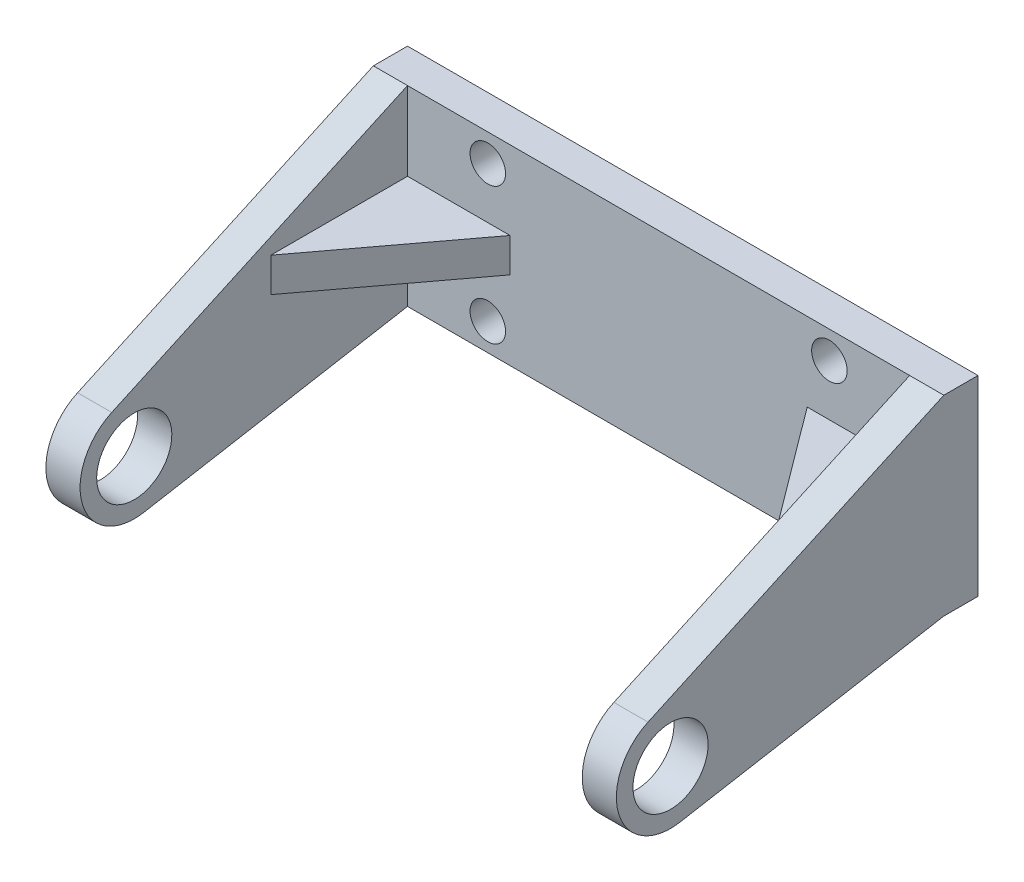
ISO-10303-21;
HEADER;
FILE_DESCRIPTION(('STEP AP214'),'2;1');
FILE_NAME('part.step','',(''),(''),'','','');
FILE_SCHEMA(('AUTOMOTIVE_DESIGN { 1 0 10303 214 1 1 1 1 }'));
ENDSEC;
DATA;
#1=APPLICATION_CONTEXT('core data for automotive mechanical design processes');
#2=APPLICATION_PROTOCOL_DEFINITION('international standard','automotive_design',2000,#1);
#3=PRODUCT_CONTEXT('',#1,'mechanical');
#4=PRODUCT('Part','Part','',(#3));
#5=PRODUCT_RELATED_PRODUCT_CATEGORY('part','',(#4));
#6=PRODUCT_DEFINITION_FORMATION('','',#4);
#7=PRODUCT_DEFINITION_CONTEXT('part definition',#1,'design');
#8=PRODUCT_DEFINITION('design','',#6,#7);
#9=PRODUCT_DEFINITION_SHAPE('','',#8);
#10=(LENGTH_UNIT() NAMED_UNIT(*) SI_UNIT(.MILLI.,.METRE.));
#11=(NAMED_UNIT(*) PLANE_ANGLE_UNIT() SI_UNIT($,.RADIAN.));
#12=(NAMED_UNIT(*) SI_UNIT($,.STERADIAN.) SOLID_ANGLE_UNIT());
#13=UNCERTAINTY_MEASURE_WITH_UNIT(LENGTH_MEASURE(1.E-05),#10,'distance_accuracy_value','');
#14=(GEOMETRIC_REPRESENTATION_CONTEXT(3) GLOBAL_UNCERTAINTY_ASSIGNED_CONTEXT((#13)) GLOBAL_UNIT_ASSIGNED_CONTEXT((#10,
#11,#12)) REPRESENTATION_CONTEXT('',''));
#15=CARTESIAN_POINT('',(0.,0.,0.));
#16=DIRECTION('',(0.,0.,1.));
#17=DIRECTION('',(1.,0.,0.));
#18=AXIS2_PLACEMENT_3D('',#15,#16,#17);
#19=CARTESIAN_POINT('',(0.,0.,5.));
#20=DIRECTION('',(0.,0.,1.));
#21=DIRECTION('',(1.,0.,0.));
#22=AXIS2_PLACEMENT_3D('',#19,#20,#21);
#23=PLANE('',#22);
#24=CARTESIAN_POINT('',(-25.,-10.,5.));
#25=DIRECTION('',(0.,0.,1.));
#26=DIRECTION('',(1.,0.,0.));
#27=AXIS2_PLACEMENT_3D('',#24,#25,#26);
#28=CIRCLE('',#27,2.6);
#29=CARTESIAN_POINT('',(-22.4,-10.,5.));
#30=VERTEX_POINT('',#29);
#31=EDGE_CURVE('E190',#30,#30,#28,.T.);
#32=ORIENTED_EDGE('',*,*,#31,.F.);
#33=EDGE_LOOP('',(#32));
#34=FACE_BOUND('',#33,.T.);
#35=CARTESIAN_POINT('',(25.,-9.99999999999999,5.));
#36=DIRECTION('',(0.,0.,1.));
#37=DIRECTION('',(1.,0.,0.));
#38=AXIS2_PLACEMENT_3D('',#35,#36,#37);
#39=CIRCLE('',#38,2.6);
#40=CARTESIAN_POINT('',(27.6,-9.99999999999999,5.));
#41=VERTEX_POINT('',#40);
#42=EDGE_CURVE('E201',#41,#41,#39,.T.);
#43=ORIENTED_EDGE('',*,*,#42,.F.);
#44=EDGE_LOOP('',(#43));
#45=FACE_BOUND('',#44,.T.);
#46=CARTESIAN_POINT('',(25.,10.,5.));
#47=DIRECTION('',(0.,0.,1.));
#48=DIRECTION('',(1.,0.,0.));
#49=AXIS2_PLACEMENT_3D('',#46,#47,#48);
#50=CIRCLE('',#49,2.6);
#51=CARTESIAN_POINT('',(27.6,10.,5.));
#52=VERTEX_POINT('',#51);
#53=EDGE_CURVE('E195',#52,#52,#50,.T.);
#54=ORIENTED_EDGE('',*,*,#53,.F.);
#55=EDGE_LOOP('',(#54));
#56=FACE_BOUND('',#55,.T.);
#57=CARTESIAN_POINT('',(-25.,10.,5.));
#58=DIRECTION('',(0.,0.,1.));
#59=DIRECTION('',(1.,0.,0.));
#60=AXIS2_PLACEMENT_3D('',#57,#58,#59);
#61=CIRCLE('',#60,2.6);
#62=CARTESIAN_POINT('',(-22.4,10.,5.));
#63=VERTEX_POINT('',#62);
#64=EDGE_CURVE('E194',#63,#63,#61,.T.);
#65=ORIENTED_EDGE('',*,*,#64,.F.);
#66=EDGE_LOOP('',(#65));
#67=FACE_BOUND('',#66,.T.);
#68=DIRECTION('',(0.,-1.,0.));
#69=VECTOR('',#68,1.);
#70=CARTESIAN_POINT('',(21.75,2.5,5.));
#71=LINE('',#70,#69);
#72=CARTESIAN_POINT('',(21.75,2.5,5.));
#73=VERTEX_POINT('',#72);
#74=CARTESIAN_POINT('',(21.75,-2.5,5.));
#75=VERTEX_POINT('',#74);
#76=EDGE_CURVE('E152',#73,#75,#71,.T.);
#77=ORIENTED_EDGE('',*,*,#76,.F.);
#78=DIRECTION('',(-1.,0.,0.));
#79=VECTOR('',#78,1.);
#80=CARTESIAN_POINT('',(21.75,2.5,5.));
#81=LINE('',#80,#79);
#82=CARTESIAN_POINT('',(36.75,2.5,5.));
#83=VERTEX_POINT('',#82);
#84=EDGE_CURVE('E158',#83,#73,#81,.T.);
#85=ORIENTED_EDGE('',*,*,#84,.F.);
#86=DIRECTION('',(0.,1.,0.));
#87=VECTOR('',#86,1.);
#88=CARTESIAN_POINT('',(36.75,-14.,5.));
#89=LINE('',#88,#87);
#90=CARTESIAN_POINT('',(36.75,14.,5.));
#91=VERTEX_POINT('',#90);
#92=EDGE_CURVE('E224',#83,#91,#89,.T.);
#93=ORIENTED_EDGE('',*,*,#92,.T.);
#94=DIRECTION('',(-1.,0.,0.));
#95=VECTOR('',#94,1.);
#96=CARTESIAN_POINT('',(-41.75,14.,5.));
#97=LINE('',#96,#95);
#98=CARTESIAN_POINT('',(-36.75,14.,5.));
#99=VERTEX_POINT('',#98);
#100=EDGE_CURVE('E287',#91,#99,#97,.T.);
#101=ORIENTED_EDGE('',*,*,#100,.T.);
#102=DIRECTION('',(0.,-1.,0.));
#103=VECTOR('',#102,1.);
#104=CARTESIAN_POINT('',(-36.75,14.,5.));
#105=LINE('',#104,#103);
#106=CARTESIAN_POINT('',(-36.75,2.5,5.));
#107=VERTEX_POINT('',#106);
#108=EDGE_CURVE('E260',#99,#107,#105,.T.);
#109=ORIENTED_EDGE('',*,*,#108,.T.);
#110=DIRECTION('',(-1.,0.,0.));
#111=VECTOR('',#110,1.);
#112=CARTESIAN_POINT('',(-36.75,2.5,5.));
#113=LINE('',#112,#111);
#114=CARTESIAN_POINT('',(-21.75,2.5,5.));
#115=VERTEX_POINT('',#114);
#116=EDGE_CURVE('E181',#115,#107,#113,.T.);
#117=ORIENTED_EDGE('',*,*,#116,.F.);
#118=DIRECTION('',(0.,-1.,0.));
#119=VECTOR('',#118,1.);
#120=CARTESIAN_POINT('',(-21.75,2.5,5.));
#121=LINE('',#120,#119);
#122=CARTESIAN_POINT('',(-21.75,-2.5,5.));
#123=VERTEX_POINT('',#122);
#124=EDGE_CURVE('E182',#115,#123,#121,.T.);
#125=ORIENTED_EDGE('',*,*,#124,.T.);
#126=DIRECTION('',(-1.,0.,0.));
#127=VECTOR('',#126,1.);
#128=CARTESIAN_POINT('',(-36.75,-2.5,5.));
#129=LINE('',#128,#127);
#130=CARTESIAN_POINT('',(-36.75,-2.5,5.));
#131=VERTEX_POINT('',#130);
#132=EDGE_CURVE('E179',#123,#131,#129,.T.);
#133=ORIENTED_EDGE('',*,*,#132,.T.);
#134=CARTESIAN_POINT('',(-36.75,-14.,5.));
#135=VERTEX_POINT('',#134);
#136=EDGE_CURVE('E258',#131,#135,#105,.T.);
#137=ORIENTED_EDGE('',*,*,#136,.T.);
#138=DIRECTION('',(1.,0.,0.));
#139=VECTOR('',#138,1.);
#140=CARTESIAN_POINT('',(-41.75,-14.,5.));
#141=LINE('',#140,#139);
#142=CARTESIAN_POINT('',(36.75,-14.,5.));
#143=VERTEX_POINT('',#142);
#144=EDGE_CURVE('E286',#135,#143,#141,.T.);
#145=ORIENTED_EDGE('',*,*,#144,.T.);
#146=CARTESIAN_POINT('',(36.75,-2.5,5.));
#147=VERTEX_POINT('',#146);
#148=EDGE_CURVE('E221',#143,#147,#89,.T.);
#149=ORIENTED_EDGE('',*,*,#148,.T.);
#150=DIRECTION('',(-1.,0.,0.));
#151=VECTOR('',#150,1.);
#152=CARTESIAN_POINT('',(21.75,-2.5,5.));
#153=LINE('',#152,#151);
#154=EDGE_CURVE('E49',#147,#75,#153,.T.);
#155=ORIENTED_EDGE('',*,*,#154,.T.);
#156=EDGE_LOOP('',(#77,#85,#93,#101,#109,#117,#125,#133,#137,#145,#149,#155));
#157=FACE_BOUND('',#156,.T.);
#158=ADVANCED_FACE('F34',(#34,#45,#56,#67,#157),#23,.T.);
#159=CARTESIAN_POINT('',(36.75,-13.,45.));
#160=DIRECTION('',(1.,0.,0.));
#161=DIRECTION('',(0.,1.,0.));
#162=AXIS2_PLACEMENT_3D('',#159,#160,#161);
#163=PLANE('',#162);
#164=CARTESIAN_POINT('',(36.75,-13.,45.));
#165=DIRECTION('',(1.,0.,0.));
#166=DIRECTION('',(0.,1.,0.));
#167=AXIS2_PLACEMENT_3D('',#164,#165,#166);
#168=CIRCLE('',#167,5.5);
#169=CARTESIAN_POINT('',(36.75,-7.49999999999999,45.));
#170=VERTEX_POINT('',#169);
#171=EDGE_CURVE('E215',#170,#170,#168,.T.);
#172=ORIENTED_EDGE('',*,*,#171,.T.);
#173=EDGE_LOOP('',(#172));
#174=FACE_BOUND('',#173,.T.);
#175=DIRECTION('',(0.,0.,-1.));
#176=VECTOR('',#175,1.);
#177=CARTESIAN_POINT('',(36.75,2.5,5.));
#178=LINE('',#177,#176);
#179=CARTESIAN_POINT('',(36.75,2.5,25.0854594809262));
#180=VERTEX_POINT('',#179);
#181=EDGE_CURVE('E157',#180,#83,#178,.T.);
#182=ORIENTED_EDGE('',*,*,#181,.F.);
#183=DIRECTION('',(0.,-1.,0.));
#184=VECTOR('',#183,1.);
#185=CARTESIAN_POINT('',(36.75,2.5,25.0854594809262));
#186=LINE('',#185,#184);
#187=CARTESIAN_POINT('',(36.75,-2.5,25.0854594809262));
#188=VERTEX_POINT('',#187);
#189=EDGE_CURVE('E154',#180,#188,#186,.T.);
#190=ORIENTED_EDGE('',*,*,#189,.T.);
#191=DIRECTION('',(0.,0.,-1.));
#192=VECTOR('',#191,1.);
#193=CARTESIAN_POINT('',(36.75,-2.5,5.));
#194=LINE('',#193,#192);
#195=EDGE_CURVE('E164',#188,#147,#194,.T.);
#196=ORIENTED_EDGE('',*,*,#195,.T.);
#197=ORIENTED_EDGE('',*,*,#148,.F.);
#198=DIRECTION('',(0.,0.173648177666926,-0.984807753012209));
#199=VECTOR('',#198,1.);
#200=CARTESIAN_POINT('',(36.75,-20.8102491769062,43.6228423440554));
#201=LINE('',#200,#199);
#202=CARTESIAN_POINT('',(36.75,-20.8102491769062,43.6228423440554));
#203=VERTEX_POINT('',#202);
#204=EDGE_CURVE('E230',#203,#143,#201,.T.);
#205=ORIENTED_EDGE('',*,*,#204,.F.);
#206=CARTESIAN_POINT('',(36.75,-13.,45.));
#207=DIRECTION('',(1.,0.,0.));
#208=DIRECTION('',(0.,1.,0.));
#209=AXIS2_PLACEMENT_3D('',#206,#207,#208);
#210=CIRCLE('',#209,7.93073485968926);
#211=CARTESIAN_POINT('',(36.75,-5.78683101503103,48.2964751794868));
#212=VERTEX_POINT('',#211);
#213=EDGE_CURVE('E227',#212,#203,#210,.T.);
#214=ORIENTED_EDGE('',*,*,#213,.F.);
#215=DIRECTION('',(0.,-0.415658225600539,0.909520884581883));
#216=VECTOR('',#215,1.);
#217=CARTESIAN_POINT('',(36.75,14.,5.));
#218=LINE('',#217,#216);
#219=EDGE_CURVE('E223',#91,#212,#218,.T.);
#220=ORIENTED_EDGE('',*,*,#219,.F.);
#221=ORIENTED_EDGE('',*,*,#92,.F.);
#222=EDGE_LOOP('',(#182,#190,#196,#197,#205,#214,#220,#221));
#223=FACE_BOUND('',#222,.T.);
#224=ADVANCED_FACE('F335',(#174,#223),#163,.F.);
#225=CARTESIAN_POINT('',(-36.75,-13.,45.));
#226=DIRECTION('',(-1.,0.,0.));
#227=DIRECTION('',(0.,-1.,0.));
#228=AXIS2_PLACEMENT_3D('',#225,#226,#227);
#229=PLANE('',#228);
#230=CARTESIAN_POINT('',(-36.75,-13.,45.));
#231=DIRECTION('',(-1.,0.,0.));
#232=DIRECTION('',(0.,-1.,0.));
#233=AXIS2_PLACEMENT_3D('',#230,#231,#232);
#234=CIRCLE('',#233,5.5);
#235=CARTESIAN_POINT('',(-36.75,-18.5,45.));
#236=VERTEX_POINT('',#235);
#237=EDGE_CURVE('E249',#236,#236,#234,.T.);
#238=ORIENTED_EDGE('',*,*,#237,.T.);
#239=EDGE_LOOP('',(#238));
#240=FACE_BOUND('',#239,.T.);
#241=DIRECTION('',(0.,0.,1.));
#242=VECTOR('',#241,1.);
#243=CARTESIAN_POINT('',(-36.75,2.5,25.));
#244=LINE('',#243,#242);
#245=CARTESIAN_POINT('',(-36.75,2.5,25.));
#246=VERTEX_POINT('',#245);
#247=EDGE_CURVE('E175',#107,#246,#244,.T.);
#248=ORIENTED_EDGE('',*,*,#247,.F.);
#249=ORIENTED_EDGE('',*,*,#108,.F.);
#250=DIRECTION('',(0.,0.415658225600539,-0.909520884581883));
#251=VECTOR('',#250,1.);
#252=CARTESIAN_POINT('',(-36.75,14.,5.));
#253=LINE('',#252,#251);
#254=CARTESIAN_POINT('',(-36.75,-5.78683101503104,48.2964751794868));
#255=VERTEX_POINT('',#254);
#256=EDGE_CURVE('E255',#255,#99,#253,.T.);
#257=ORIENTED_EDGE('',*,*,#256,.F.);
#258=CARTESIAN_POINT('',(-36.75,-13.,45.));
#259=DIRECTION('',(-1.,0.,0.));
#260=DIRECTION('',(0.,-1.,0.));
#261=AXIS2_PLACEMENT_3D('',#258,#259,#260);
#262=CIRCLE('',#261,7.93073485968926);
#263=CARTESIAN_POINT('',(-36.75,-20.8102491769062,43.6228423440554));
#264=VERTEX_POINT('',#263);
#265=EDGE_CURVE('E266',#264,#255,#262,.T.);
#266=ORIENTED_EDGE('',*,*,#265,.F.);
#267=DIRECTION('',(0.,-0.173648177666926,0.984807753012209));
#268=VECTOR('',#267,1.);
#269=CARTESIAN_POINT('',(-36.75,-14.,5.));
#270=LINE('',#269,#268);
#271=EDGE_CURVE('E263',#135,#264,#270,.T.);
#272=ORIENTED_EDGE('',*,*,#271,.F.);
#273=ORIENTED_EDGE('',*,*,#136,.F.);
#274=DIRECTION('',(0.,0.,1.));
#275=VECTOR('',#274,1.);
#276=CARTESIAN_POINT('',(-36.75,-2.5,25.));
#277=LINE('',#276,#275);
#278=CARTESIAN_POINT('',(-36.75,-2.5,25.));
#279=VERTEX_POINT('',#278);
#280=EDGE_CURVE('E167',#131,#279,#277,.T.);
#281=ORIENTED_EDGE('',*,*,#280,.T.);
#282=DIRECTION('',(0.,-1.,0.));
#283=VECTOR('',#282,1.);
#284=CARTESIAN_POINT('',(-36.75,2.5,25.));
#285=LINE('',#284,#283);
#286=EDGE_CURVE('E57',#246,#279,#285,.T.);
#287=ORIENTED_EDGE('',*,*,#286,.F.);
#288=EDGE_LOOP('',(#248,#249,#257,#266,#272,#273,#281,#287));
#289=FACE_BOUND('',#288,.T.);
#290=ADVANCED_FACE('F355',(#240,#289),#229,.F.);
#291=CARTESIAN_POINT('',(41.75,14.,5.));
#292=DIRECTION('',(-1.,0.,0.));
#293=DIRECTION('',(0.,0.,1.));
#294=AXIS2_PLACEMENT_3D('',#291,#292,#293);
#295=PLANE('',#294);
#296=DIRECTION('',(0.,1.,0.));
#297=VECTOR('',#296,1.);
#298=CARTESIAN_POINT('',(41.75,14.,0.));
#299=LINE('',#298,#297);
#300=CARTESIAN_POINT('',(41.75,-14.,0.));
#301=VERTEX_POINT('',#300);
#302=CARTESIAN_POINT('',(41.75,14.,0.));
#303=VERTEX_POINT('',#302);
#304=EDGE_CURVE('E279',#301,#303,#299,.T.);
#305=ORIENTED_EDGE('',*,*,#304,.T.);
#306=DIRECTION('',(0.,0.,-1.));
#307=VECTOR('',#306,1.);
#308=CARTESIAN_POINT('',(41.75,14.,5.));
#309=LINE('',#308,#307);
#310=CARTESIAN_POINT('',(41.75,14.,5.));
#311=VERTEX_POINT('',#310);
#312=EDGE_CURVE('E11',#311,#303,#309,.T.);
#313=ORIENTED_EDGE('',*,*,#312,.F.);
#314=DIRECTION('',(0.,-0.415658225600539,0.909520884581883));
#315=VECTOR('',#314,1.);
#316=CARTESIAN_POINT('',(41.75,14.,5.));
#317=LINE('',#316,#315);
#318=CARTESIAN_POINT('',(41.75,-5.78683101503103,48.2964751794868));
#319=VERTEX_POINT('',#318);
#320=EDGE_CURVE('E218',#311,#319,#317,.T.);
#321=ORIENTED_EDGE('',*,*,#320,.T.);
#322=CARTESIAN_POINT('',(41.75,-13.,45.));
#323=DIRECTION('',(1.,0.,0.));
#324=DIRECTION('',(0.,1.,0.));
#325=AXIS2_PLACEMENT_3D('',#322,#323,#324);
#326=CIRCLE('',#325,7.93073485968926);
#327=CARTESIAN_POINT('',(41.75,-20.8102491769062,43.6228423440554));
#328=VERTEX_POINT('',#327);
#329=EDGE_CURVE('E236',#319,#328,#326,.T.);
#330=ORIENTED_EDGE('',*,*,#329,.T.);
#331=DIRECTION('',(0.,0.173648177666926,-0.984807753012209));
#332=VECTOR('',#331,1.);
#333=CARTESIAN_POINT('',(41.75,-20.8102491769062,43.6228423440554));
#334=LINE('',#333,#332);
#335=CARTESIAN_POINT('',(41.75,-14.,5.));
#336=VERTEX_POINT('',#335);
#337=EDGE_CURVE('E239',#328,#336,#334,.T.);
#338=ORIENTED_EDGE('',*,*,#337,.T.);
#339=DIRECTION('',(0.,0.,-1.));
#340=VECTOR('',#339,1.);
#341=CARTESIAN_POINT('',(41.75,-14.,5.));
#342=LINE('',#341,#340);
#343=EDGE_CURVE('E291',#336,#301,#342,.T.);
#344=ORIENTED_EDGE('',*,*,#343,.T.);
#345=EDGE_LOOP('',(#305,#313,#321,#330,#338,#344));
#346=FACE_BOUND('',#345,.T.);
#347=CARTESIAN_POINT('',(41.75,-13.,45.));
#348=DIRECTION('',(1.,0.,0.));
#349=DIRECTION('',(0.,1.,0.));
#350=AXIS2_PLACEMENT_3D('',#347,#348,#349);
#351=CIRCLE('',#350,5.5);
#352=CARTESIAN_POINT('',(41.75,-7.49999999999999,45.));
#353=VERTEX_POINT('',#352);
#354=EDGE_CURVE('E212',#353,#353,#351,.T.);
#355=ORIENTED_EDGE('',*,*,#354,.F.);
#356=EDGE_LOOP('',(#355));
#357=FACE_BOUND('',#356,.T.);
#358=ADVANCED_FACE('F36',(#346,#357),#295,.F.);
#359=CARTESIAN_POINT('',(-41.75,14.,5.));
#360=DIRECTION('',(0.,-1.,0.));
#361=DIRECTION('',(0.,0.,-1.));
#362=AXIS2_PLACEMENT_3D('',#359,#360,#361);
#363=PLANE('',#362);
#364=DIRECTION('',(-1.,0.,0.));
#365=VECTOR('',#364,1.);
#366=CARTESIAN_POINT('',(-41.75,14.,0.));
#367=LINE('',#366,#365);
#368=CARTESIAN_POINT('',(-41.75,14.,0.));
#369=VERTEX_POINT('',#368);
#370=EDGE_CURVE('E294',#303,#369,#367,.T.);
#371=ORIENTED_EDGE('',*,*,#370,.T.);
#372=DIRECTION('',(0.,0.,-1.));
#373=VECTOR('',#372,1.);
#374=CARTESIAN_POINT('',(-41.75,14.,5.));
#375=LINE('',#374,#373);
#376=CARTESIAN_POINT('',(-41.75,14.,5.));
#377=VERTEX_POINT('',#376);
#378=EDGE_CURVE('E42',#377,#369,#375,.T.);
#379=ORIENTED_EDGE('',*,*,#378,.F.);
#380=DIRECTION('',(-1.,0.,0.));
#381=VECTOR('',#380,1.);
#382=CARTESIAN_POINT('',(-36.75,14.,5.));
#383=LINE('',#382,#381);
#384=EDGE_CURVE('E269',#99,#377,#383,.T.);
#385=ORIENTED_EDGE('',*,*,#384,.F.);
#386=ORIENTED_EDGE('',*,*,#100,.F.);
#387=EDGE_CURVE('E283',#311,#91,#97,.T.);
#388=ORIENTED_EDGE('',*,*,#387,.F.);
#389=ORIENTED_EDGE('',*,*,#312,.T.);
#390=EDGE_LOOP('',(#371,#379,#385,#386,#388,#389));
#391=FACE_BOUND('',#390,.T.);
#392=ADVANCED_FACE('F370',(#391),#363,.F.);
#393=CARTESIAN_POINT('',(-41.75,14.,5.));
#394=DIRECTION('',(1.,0.,0.));
#395=DIRECTION('',(0.,0.,-1.));
#396=AXIS2_PLACEMENT_3D('',#393,#394,#395);
#397=PLANE('',#396);
#398=DIRECTION('',(0.,-1.,0.));
#399=VECTOR('',#398,1.);
#400=CARTESIAN_POINT('',(-41.75,14.,0.));
#401=LINE('',#400,#399);
#402=CARTESIAN_POINT('',(-41.75,-14.,0.));
#403=VERTEX_POINT('',#402);
#404=EDGE_CURVE('E296',#369,#403,#401,.T.);
#405=ORIENTED_EDGE('',*,*,#404,.T.);
#406=DIRECTION('',(0.,0.,-1.));
#407=VECTOR('',#406,1.);
#408=CARTESIAN_POINT('',(-41.75,-14.,5.));
#409=LINE('',#408,#407);
#410=CARTESIAN_POINT('',(-41.75,-14.,5.));
#411=VERTEX_POINT('',#410);
#412=EDGE_CURVE('E302',#411,#403,#409,.T.);
#413=ORIENTED_EDGE('',*,*,#412,.F.);
#414=DIRECTION('',(0.,-0.173648177666926,0.984807753012209));
#415=VECTOR('',#414,1.);
#416=CARTESIAN_POINT('',(-41.75,-14.,5.));
#417=LINE('',#416,#415);
#418=CARTESIAN_POINT('',(-41.75,-20.8102491769062,43.6228423440554));
#419=VERTEX_POINT('',#418);
#420=EDGE_CURVE('E272',#411,#419,#417,.T.);
#421=ORIENTED_EDGE('',*,*,#420,.T.);
#422=CARTESIAN_POINT('',(-41.75,-13.,45.));
#423=DIRECTION('',(-1.,0.,0.));
#424=DIRECTION('',(0.,-1.,0.));
#425=AXIS2_PLACEMENT_3D('',#422,#423,#424);
#426=CIRCLE('',#425,7.93073485968926);
#427=CARTESIAN_POINT('',(-41.75,-5.78683101503104,48.2964751794868));
#428=VERTEX_POINT('',#427);
#429=EDGE_CURVE('E259',#419,#428,#426,.T.);
#430=ORIENTED_EDGE('',*,*,#429,.T.);
#431=DIRECTION('',(0.,0.415658225600539,-0.909520884581883));
#432=VECTOR('',#431,1.);
#433=CARTESIAN_POINT('',(-41.75,14.,5.));
#434=LINE('',#433,#432);
#435=EDGE_CURVE('E252',#428,#377,#434,.T.);
#436=ORIENTED_EDGE('',*,*,#435,.T.);
#437=ORIENTED_EDGE('',*,*,#378,.T.);
#438=EDGE_LOOP('',(#405,#413,#421,#430,#436,#437));
#439=FACE_BOUND('',#438,.T.);
#440=CARTESIAN_POINT('',(-41.75,-13.,45.));
#441=DIRECTION('',(-1.,0.,0.));
#442=DIRECTION('',(0.,-1.,0.));
#443=AXIS2_PLACEMENT_3D('',#440,#441,#442);
#444=CIRCLE('',#443,5.5);
#445=CARTESIAN_POINT('',(-41.75,-18.5,45.));
#446=VERTEX_POINT('',#445);
#447=EDGE_CURVE('E245',#446,#446,#444,.T.);
#448=ORIENTED_EDGE('',*,*,#447,.F.);
#449=EDGE_LOOP('',(#448));
#450=FACE_BOUND('',#449,.T.);
#451=ADVANCED_FACE('F308',(#439,#450),#397,.F.);
#452=CARTESIAN_POINT('',(-41.75,-14.,5.));
#453=DIRECTION('',(0.,1.,0.));
#454=DIRECTION('',(0.,0.,1.));
#455=AXIS2_PLACEMENT_3D('',#452,#453,#454);
#456=PLANE('',#455);
#457=DIRECTION('',(1.,0.,0.));
#458=VECTOR('',#457,1.);
#459=CARTESIAN_POINT('',(-41.75,-14.,0.));
#460=LINE('',#459,#458);
#461=EDGE_CURVE('E298',#403,#301,#460,.T.);
#462=ORIENTED_EDGE('',*,*,#461,.T.);
#463=ORIENTED_EDGE('',*,*,#343,.F.);
#464=DIRECTION('',(1.,0.,0.));
#465=VECTOR('',#464,1.);
#466=CARTESIAN_POINT('',(36.75,-14.,5.));
#467=LINE('',#466,#465);
#468=EDGE_CURVE('E242',#143,#336,#467,.T.);
#469=ORIENTED_EDGE('',*,*,#468,.F.);
#470=ORIENTED_EDGE('',*,*,#144,.F.);
#471=EDGE_CURVE('E288',#411,#135,#141,.T.);
#472=ORIENTED_EDGE('',*,*,#471,.F.);
#473=ORIENTED_EDGE('',*,*,#412,.T.);
#474=EDGE_LOOP('',(#462,#463,#469,#470,#472,#473));
#475=FACE_BOUND('',#474,.T.);
#476=ADVANCED_FACE('F319',(#475),#456,.F.);
#477=CARTESIAN_POINT('',(0.,0.,0.));
#478=DIRECTION('',(0.,0.,1.));
#479=DIRECTION('',(1.,0.,0.));
#480=AXIS2_PLACEMENT_3D('',#477,#478,#479);
#481=PLANE('',#480);
#482=CARTESIAN_POINT('',(-25.,-10.,0.));
#483=DIRECTION('',(0.,0.,1.));
#484=DIRECTION('',(1.,0.,0.));
#485=AXIS2_PLACEMENT_3D('',#482,#483,#484);
#486=CIRCLE('',#485,2.6);
#487=CARTESIAN_POINT('',(-22.4,-10.,0.));
#488=VERTEX_POINT('',#487);
#489=EDGE_CURVE('E204',#488,#488,#486,.T.);
#490=ORIENTED_EDGE('',*,*,#489,.T.);
#491=EDGE_LOOP('',(#490));
#492=FACE_BOUND('',#491,.T.);
#493=CARTESIAN_POINT('',(25.,-9.99999999999999,0.));
#494=DIRECTION('',(0.,0.,1.));
#495=DIRECTION('',(1.,0.,0.));
#496=AXIS2_PLACEMENT_3D('',#493,#494,#495);
#497=CIRCLE('',#496,2.6);
#498=CARTESIAN_POINT('',(27.6,-9.99999999999999,0.));
#499=VERTEX_POINT('',#498);
#500=EDGE_CURVE('E198',#499,#499,#497,.T.);
#501=ORIENTED_EDGE('',*,*,#500,.T.);
#502=EDGE_LOOP('',(#501));
#503=FACE_BOUND('',#502,.T.);
#504=CARTESIAN_POINT('',(25.,10.,0.));
#505=DIRECTION('',(0.,0.,1.));
#506=DIRECTION('',(1.,0.,0.));
#507=AXIS2_PLACEMENT_3D('',#504,#505,#506);
#508=CIRCLE('',#507,2.6);
#509=CARTESIAN_POINT('',(27.6,10.,0.));
#510=VERTEX_POINT('',#509);
#511=EDGE_CURVE('E191',#510,#510,#508,.T.);
#512=ORIENTED_EDGE('',*,*,#511,.T.);
#513=EDGE_LOOP('',(#512));
#514=FACE_BOUND('',#513,.T.);
#515=CARTESIAN_POINT('',(-25.,10.,0.));
#516=DIRECTION('',(0.,0.,1.));
#517=DIRECTION('',(1.,0.,0.));
#518=AXIS2_PLACEMENT_3D('',#515,#516,#517);
#519=CIRCLE('',#518,2.6);
#520=CARTESIAN_POINT('',(-22.4,10.,0.));
#521=VERTEX_POINT('',#520);
#522=EDGE_CURVE('E209',#521,#521,#519,.T.);
#523=ORIENTED_EDGE('',*,*,#522,.T.);
#524=EDGE_LOOP('',(#523));
#525=FACE_BOUND('',#524,.T.);
#526=ORIENTED_EDGE('',*,*,#304,.F.);
#527=ORIENTED_EDGE('',*,*,#461,.F.);
#528=ORIENTED_EDGE('',*,*,#404,.F.);
#529=ORIENTED_EDGE('',*,*,#370,.F.);
#530=EDGE_LOOP('',(#526,#527,#528,#529));
#531=FACE_BOUND('',#530,.T.);
#532=ADVANCED_FACE('F317',(#492,#503,#514,#525,#531),#481,.F.);
#533=CARTESIAN_POINT('',(-36.75,14.,5.));
#534=DIRECTION('',(0.,0.909520884581883,0.415658225600539));
#535=DIRECTION('',(0.,-0.415658225600539,0.909520884581883));
#536=AXIS2_PLACEMENT_3D('',#533,#534,#535);
#537=PLANE('',#536);
#538=ORIENTED_EDGE('',*,*,#435,.F.);
#539=DIRECTION('',(-1.,0.,0.));
#540=VECTOR('',#539,1.);
#541=CARTESIAN_POINT('',(-36.75,-5.78683101503104,48.2964751794868));
#542=LINE('',#541,#540);
#543=EDGE_CURVE('E277',#255,#428,#542,.T.);
#544=ORIENTED_EDGE('',*,*,#543,.F.);
#545=ORIENTED_EDGE('',*,*,#256,.T.);
#546=ORIENTED_EDGE('',*,*,#384,.T.);
#547=EDGE_LOOP('',(#538,#544,#545,#546));
#548=FACE_BOUND('',#547,.T.);
#549=ADVANCED_FACE('F362',(#548),#537,.T.);
#550=CARTESIAN_POINT('',(-36.75,-13.,45.));
#551=DIRECTION('',(-1.,0.,0.));
#552=DIRECTION('',(0.,-1.,0.));
#553=AXIS2_PLACEMENT_3D('',#550,#551,#552);
#554=CYLINDRICAL_SURFACE('',#553,7.93073485968926);
#555=ORIENTED_EDGE('',*,*,#429,.F.);
#556=DIRECTION('',(-1.,0.,0.));
#557=VECTOR('',#556,1.);
#558=CARTESIAN_POINT('',(-36.75,-20.8102491769062,43.6228423440554));
#559=LINE('',#558,#557);
#560=EDGE_CURVE('E280',#264,#419,#559,.T.);
#561=ORIENTED_EDGE('',*,*,#560,.F.);
#562=ORIENTED_EDGE('',*,*,#265,.T.);
#563=ORIENTED_EDGE('',*,*,#543,.T.);
#564=EDGE_LOOP('',(#555,#561,#562,#563));
#565=FACE_BOUND('',#564,.T.);
#566=ADVANCED_FACE('F390',(#565),#554,.T.);
#567=CARTESIAN_POINT('',(-36.75,-14.,5.));
#568=DIRECTION('',(0.,-0.984807753012209,-0.173648177666926));
#569=DIRECTION('',(0.,0.173648177666926,-0.984807753012209));
#570=AXIS2_PLACEMENT_3D('',#567,#568,#569);
#571=PLANE('',#570);
#572=ORIENTED_EDGE('',*,*,#420,.F.);
#573=ORIENTED_EDGE('',*,*,#471,.T.);
#574=ORIENTED_EDGE('',*,*,#271,.T.);
#575=ORIENTED_EDGE('',*,*,#560,.T.);
#576=EDGE_LOOP('',(#572,#573,#574,#575));
#577=FACE_BOUND('',#576,.T.);
#578=ADVANCED_FACE('F392',(#577),#571,.T.);
#579=CARTESIAN_POINT('',(-36.75,-13.,45.));
#580=DIRECTION('',(-1.,0.,0.));
#581=DIRECTION('',(0.,-1.,0.));
#582=AXIS2_PLACEMENT_3D('',#579,#580,#581);
#583=CYLINDRICAL_SURFACE('',#582,5.5);
#584=ORIENTED_EDGE('',*,*,#237,.F.);
#585=EDGE_LOOP('',(#584));
#586=FACE_BOUND('',#585,.T.);
#587=ORIENTED_EDGE('',*,*,#447,.T.);
#588=EDGE_LOOP('',(#587));
#589=FACE_BOUND('',#588,.T.);
#590=ADVANCED_FACE('F432',(#586,#589),#583,.F.);
#591=CARTESIAN_POINT('',(36.75,-20.8102491769062,43.6228423440554));
#592=DIRECTION('',(0.,-0.984807753012209,-0.173648177666926));
#593=DIRECTION('',(0.,0.173648177666926,-0.984807753012209));
#594=AXIS2_PLACEMENT_3D('',#591,#592,#593);
#595=PLANE('',#594);
#596=ORIENTED_EDGE('',*,*,#337,.F.);
#597=DIRECTION('',(1.,0.,0.));
#598=VECTOR('',#597,1.);
#599=CARTESIAN_POINT('',(36.75,-20.8102491769062,43.6228423440554));
#600=LINE('',#599,#598);
#601=EDGE_CURVE('E246',#203,#328,#600,.T.);
#602=ORIENTED_EDGE('',*,*,#601,.F.);
#603=ORIENTED_EDGE('',*,*,#204,.T.);
#604=ORIENTED_EDGE('',*,*,#468,.T.);
#605=EDGE_LOOP('',(#596,#602,#603,#604));
#606=FACE_BOUND('',#605,.T.);
#607=ADVANCED_FACE('F327',(#606),#595,.T.);
#608=CARTESIAN_POINT('',(36.75,-13.,45.));
#609=DIRECTION('',(1.,0.,0.));
#610=DIRECTION('',(0.,1.,0.));
#611=AXIS2_PLACEMENT_3D('',#608,#609,#610);
#612=CYLINDRICAL_SURFACE('',#611,7.93073485968926);
#613=ORIENTED_EDGE('',*,*,#329,.F.);
#614=DIRECTION('',(1.,0.,0.));
#615=VECTOR('',#614,1.);
#616=CARTESIAN_POINT('',(36.75,-5.78683101503103,48.2964751794868));
#617=LINE('',#616,#615);
#618=EDGE_CURVE('E233',#212,#319,#617,.T.);
#619=ORIENTED_EDGE('',*,*,#618,.F.);
#620=ORIENTED_EDGE('',*,*,#213,.T.);
#621=ORIENTED_EDGE('',*,*,#601,.T.);
#622=EDGE_LOOP('',(#613,#619,#620,#621));
#623=FACE_BOUND('',#622,.T.);
#624=ADVANCED_FACE('F381',(#623),#612,.T.);
#625=CARTESIAN_POINT('',(36.75,14.,5.));
#626=DIRECTION('',(0.,0.909520884581883,0.415658225600539));
#627=DIRECTION('',(0.,-0.415658225600539,0.909520884581883));
#628=AXIS2_PLACEMENT_3D('',#625,#626,#627);
#629=PLANE('',#628);
#630=ORIENTED_EDGE('',*,*,#320,.F.);
#631=ORIENTED_EDGE('',*,*,#387,.T.);
#632=ORIENTED_EDGE('',*,*,#219,.T.);
#633=ORIENTED_EDGE('',*,*,#618,.T.);
#634=EDGE_LOOP('',(#630,#631,#632,#633));
#635=FACE_BOUND('',#634,.T.);
#636=ADVANCED_FACE('F378',(#635),#629,.T.);
#637=CARTESIAN_POINT('',(36.75,-13.,45.));
#638=DIRECTION('',(1.,0.,0.));
#639=DIRECTION('',(0.,1.,0.));
#640=AXIS2_PLACEMENT_3D('',#637,#638,#639);
#641=CYLINDRICAL_SURFACE('',#640,5.5);
#642=ORIENTED_EDGE('',*,*,#171,.F.);
#643=EDGE_LOOP('',(#642));
#644=FACE_BOUND('',#643,.T.);
#645=ORIENTED_EDGE('',*,*,#354,.T.);
#646=EDGE_LOOP('',(#645));
#647=FACE_BOUND('',#646,.T.);
#648=ADVANCED_FACE('F425',(#644,#647),#641,.F.);
#649=CARTESIAN_POINT('',(-25.,10.,0.));
#650=DIRECTION('',(0.,0.,1.));
#651=DIRECTION('',(1.,0.,0.));
#652=AXIS2_PLACEMENT_3D('',#649,#650,#651);
#653=CYLINDRICAL_SURFACE('',#652,2.6);
#654=ORIENTED_EDGE('',*,*,#522,.F.);
#655=EDGE_LOOP('',(#654));
#656=FACE_BOUND('',#655,.T.);
#657=ORIENTED_EDGE('',*,*,#64,.T.);
#658=EDGE_LOOP('',(#657));
#659=FACE_BOUND('',#658,.T.);
#660=ADVANCED_FACE('F415',(#656,#659),#653,.F.);
#661=CARTESIAN_POINT('',(25.,10.,0.));
#662=DIRECTION('',(0.,0.,1.));
#663=DIRECTION('',(1.,0.,0.));
#664=AXIS2_PLACEMENT_3D('',#661,#662,#663);
#665=CYLINDRICAL_SURFACE('',#664,2.6);
#666=ORIENTED_EDGE('',*,*,#511,.F.);
#667=EDGE_LOOP('',(#666));
#668=FACE_BOUND('',#667,.T.);
#669=ORIENTED_EDGE('',*,*,#53,.T.);
#670=EDGE_LOOP('',(#669));
#671=FACE_BOUND('',#670,.T.);
#672=ADVANCED_FACE('F411',(#668,#671),#665,.F.);
#673=CARTESIAN_POINT('',(25.,-9.99999999999999,0.));
#674=DIRECTION('',(0.,0.,1.));
#675=DIRECTION('',(1.,0.,0.));
#676=AXIS2_PLACEMENT_3D('',#673,#674,#675);
#677=CYLINDRICAL_SURFACE('',#676,2.6);
#678=ORIENTED_EDGE('',*,*,#500,.F.);
#679=EDGE_LOOP('',(#678));
#680=FACE_BOUND('',#679,.T.);
#681=ORIENTED_EDGE('',*,*,#42,.T.);
#682=EDGE_LOOP('',(#681));
#683=FACE_BOUND('',#682,.T.);
#684=ADVANCED_FACE('F414',(#680,#683),#677,.F.);
#685=CARTESIAN_POINT('',(-25.,-10.,0.));
#686=DIRECTION('',(0.,0.,1.));
#687=DIRECTION('',(1.,0.,0.));
#688=AXIS2_PLACEMENT_3D('',#685,#686,#687);
#689=CYLINDRICAL_SURFACE('',#688,2.6);
#690=ORIENTED_EDGE('',*,*,#489,.F.);
#691=EDGE_LOOP('',(#690));
#692=FACE_BOUND('',#691,.T.);
#693=ORIENTED_EDGE('',*,*,#31,.T.);
#694=EDGE_LOOP('',(#693));
#695=FACE_BOUND('',#694,.T.);
#696=ADVANCED_FACE('F408',(#692,#695),#689,.F.);
#697=CARTESIAN_POINT('',(-21.75,2.5,5.));
#698=DIRECTION('',(-0.8,0.,-0.6));
#699=DIRECTION('',(-0.6,0.,0.8));
#700=AXIS2_PLACEMENT_3D('',#697,#698,#699);
#701=PLANE('',#700);
#702=DIRECTION('',(0.6,0.,-0.8));
#703=VECTOR('',#702,1.);
#704=CARTESIAN_POINT('',(-21.75,-2.5,5.));
#705=LINE('',#704,#703);
#706=EDGE_CURVE('E170',#279,#123,#705,.T.);
#707=ORIENTED_EDGE('',*,*,#706,.T.);
#708=ORIENTED_EDGE('',*,*,#124,.F.);
#709=DIRECTION('',(0.6,0.,-0.8));
#710=VECTOR('',#709,1.);
#711=CARTESIAN_POINT('',(-21.75,2.5,5.));
#712=LINE('',#711,#710);
#713=EDGE_CURVE('E178',#246,#115,#712,.T.);
#714=ORIENTED_EDGE('',*,*,#713,.F.);
#715=ORIENTED_EDGE('',*,*,#286,.T.);
#716=EDGE_LOOP('',(#707,#708,#714,#715));
#717=FACE_BOUND('',#716,.T.);
#718=ADVANCED_FACE('F398',(#717),#701,.F.);
#719=CARTESIAN_POINT('',(0.,2.5,0.));
#720=DIRECTION('',(0.,-1.,0.));
#721=DIRECTION('',(0.,0.,-1.));
#722=AXIS2_PLACEMENT_3D('',#719,#720,#721);
#723=PLANE('',#722);
#724=ORIENTED_EDGE('',*,*,#247,.T.);
#725=ORIENTED_EDGE('',*,*,#713,.T.);
#726=ORIENTED_EDGE('',*,*,#116,.T.);
#727=EDGE_LOOP('',(#724,#725,#726));
#728=FACE_BOUND('',#727,.T.);
#729=ADVANCED_FACE('F400',(#728),#723,.F.);
#730=CARTESIAN_POINT('',(0.,-2.5,0.));
#731=DIRECTION('',(0.,-1.,0.));
#732=DIRECTION('',(0.,0.,-1.));
#733=AXIS2_PLACEMENT_3D('',#730,#731,#732);
#734=PLANE('',#733);
#735=ORIENTED_EDGE('',*,*,#280,.F.);
#736=ORIENTED_EDGE('',*,*,#132,.F.);
#737=ORIENTED_EDGE('',*,*,#706,.F.);
#738=EDGE_LOOP('',(#735,#736,#737));
#739=FACE_BOUND('',#738,.T.);
#740=ADVANCED_FACE('F395',(#739),#734,.T.);
#741=CARTESIAN_POINT('',(36.75,2.5,25.0854594809262));
#742=DIRECTION('',(0.801225584250385,0.,-0.598362401177271));
#743=DIRECTION('',(-0.598362401177271,0.,-0.801225584250385));
#744=AXIS2_PLACEMENT_3D('',#741,#742,#743);
#745=PLANE('',#744);
#746=DIRECTION('',(0.598362401177271,0.,0.801225584250385));
#747=VECTOR('',#746,1.);
#748=CARTESIAN_POINT('',(36.75,-2.5,25.0854594809262));
#749=LINE('',#748,#747);
#750=EDGE_CURVE('E337',#75,#188,#749,.T.);
#751=ORIENTED_EDGE('',*,*,#750,.T.);
#752=ORIENTED_EDGE('',*,*,#189,.F.);
#753=DIRECTION('',(0.598362401177271,0.,0.801225584250385));
#754=VECTOR('',#753,1.);
#755=CARTESIAN_POINT('',(36.75,2.5,25.0854594809262));
#756=LINE('',#755,#754);
#757=EDGE_CURVE('E148',#73,#180,#756,.T.);
#758=ORIENTED_EDGE('',*,*,#757,.F.);
#759=ORIENTED_EDGE('',*,*,#76,.T.);
#760=EDGE_LOOP('',(#751,#752,#758,#759));
#761=FACE_BOUND('',#760,.T.);
#762=ADVANCED_FACE('F150',(#761),#745,.F.);
#763=CARTESIAN_POINT('',(0.,2.5,0.));
#764=DIRECTION('',(0.,-1.,0.));
#765=DIRECTION('',(0.,0.,-1.));
#766=AXIS2_PLACEMENT_3D('',#763,#764,#765);
#767=PLANE('',#766);
#768=ORIENTED_EDGE('',*,*,#84,.T.);
#769=ORIENTED_EDGE('',*,*,#757,.T.);
#770=ORIENTED_EDGE('',*,*,#181,.T.);
#771=EDGE_LOOP('',(#768,#769,#770));
#772=FACE_BOUND('',#771,.T.);
#773=ADVANCED_FACE('F161',(#772),#767,.F.);
#774=CARTESIAN_POINT('',(0.,-2.5,0.));
#775=DIRECTION('',(0.,-1.,0.));
#776=DIRECTION('',(0.,0.,-1.));
#777=AXIS2_PLACEMENT_3D('',#774,#775,#776);
#778=PLANE('',#777);
#779=ORIENTED_EDGE('',*,*,#154,.F.);
#780=ORIENTED_EDGE('',*,*,#195,.F.);
#781=ORIENTED_EDGE('',*,*,#750,.F.);
#782=EDGE_LOOP('',(#779,#780,#781));
#783=FACE_BOUND('',#782,.T.);
#784=ADVANCED_FACE('F341',(#783),#778,.T.);
#785=CLOSED_SHELL('',(#158,#224,#290,#358,#392,#451,#476,#532,#549,#566,#578,#590,#607,#624,
#636,#648,#660,#672,#684,#696,#718,#729,#740,#762,#773,#784));
#786=MANIFOLD_SOLID_BREP('B2',#785);
#787=ADVANCED_BREP_SHAPE_REPRESENTATION('',(#18,#786),#14);
#788=SHAPE_DEFINITION_REPRESENTATION(#9,#787);
ENDSEC;
END-ISO-10303-21;
